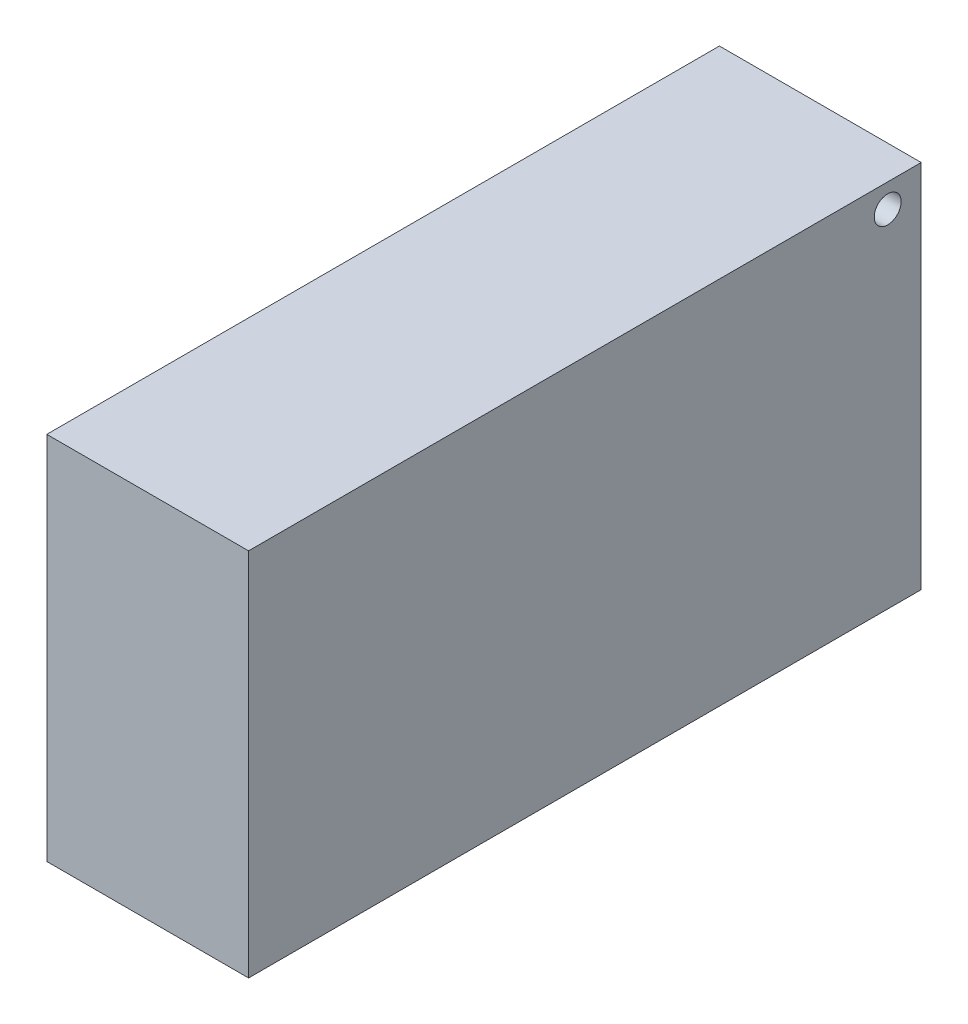
ISO-10303-21;
HEADER;
FILE_DESCRIPTION(('STEP AP214'),'2;1');
FILE_NAME('part.step','',(''),(''),'','','');
FILE_SCHEMA(('AUTOMOTIVE_DESIGN { 1 0 10303 214 1 1 1 1 }'));
ENDSEC;
DATA;
#1=APPLICATION_CONTEXT('core data for automotive mechanical design processes');
#2=APPLICATION_PROTOCOL_DEFINITION('international standard','automotive_design',2000,#1);
#3=PRODUCT_CONTEXT('',#1,'mechanical');
#4=PRODUCT('Part','Part','',(#3));
#5=PRODUCT_RELATED_PRODUCT_CATEGORY('part','',(#4));
#6=PRODUCT_DEFINITION_FORMATION('','',#4);
#7=PRODUCT_DEFINITION_CONTEXT('part definition',#1,'design');
#8=PRODUCT_DEFINITION('design','',#6,#7);
#9=PRODUCT_DEFINITION_SHAPE('','',#8);
#10=(LENGTH_UNIT() NAMED_UNIT(*) SI_UNIT(.MILLI.,.METRE.));
#11=(NAMED_UNIT(*) PLANE_ANGLE_UNIT() SI_UNIT($,.RADIAN.));
#12=(NAMED_UNIT(*) SI_UNIT($,.STERADIAN.) SOLID_ANGLE_UNIT());
#13=UNCERTAINTY_MEASURE_WITH_UNIT(LENGTH_MEASURE(1.E-05),#10,'distance_accuracy_value','');
#14=(GEOMETRIC_REPRESENTATION_CONTEXT(3) GLOBAL_UNCERTAINTY_ASSIGNED_CONTEXT((#13)) GLOBAL_UNIT_ASSIGNED_CONTEXT((#10,
#11,#12)) REPRESENTATION_CONTEXT('',''));
#15=CARTESIAN_POINT('',(0.,0.,0.));
#16=DIRECTION('',(0.,0.,1.));
#17=DIRECTION('',(1.,0.,0.));
#18=AXIS2_PLACEMENT_3D('',#15,#16,#17);
#19=CARTESIAN_POINT('',(60.,108.090723229566,-211.993791229898));
#20=DIRECTION('',(0.,0.,1.));
#21=DIRECTION('',(1.,0.,0.));
#22=AXIS2_PLACEMENT_3D('',#19,#20,#21);
#23=PLANE('',#22);
#24=DIRECTION('',(0.,1.,0.));
#25=VECTOR('',#24,1.);
#26=CARTESIAN_POINT('',(0.,108.090723229566,-211.993791229898));
#27=LINE('',#26,#25);
#28=CARTESIAN_POINT('',(0.,-1.90927677043413,-211.993791229898));
#29=VERTEX_POINT('',#28);
#30=CARTESIAN_POINT('',(0.,108.090723229566,-211.993791229898));
#31=VERTEX_POINT('',#30);
#32=EDGE_CURVE('E98',#29,#31,#27,.T.);
#33=ORIENTED_EDGE('',*,*,#32,.T.);
#34=DIRECTION('',(-1.,0.,0.));
#35=VECTOR('',#34,1.);
#36=CARTESIAN_POINT('',(60.,108.090723229566,-211.993791229898));
#37=LINE('',#36,#35);
#38=CARTESIAN_POINT('',(60.,108.090723229566,-211.993791229898));
#39=VERTEX_POINT('',#38);
#40=EDGE_CURVE('E11',#39,#31,#37,.T.);
#41=ORIENTED_EDGE('',*,*,#40,.F.);
#42=DIRECTION('',(0.,1.,0.));
#43=VECTOR('',#42,1.);
#44=CARTESIAN_POINT('',(60.,108.090723229566,-211.993791229898));
#45=LINE('',#44,#43);
#46=CARTESIAN_POINT('',(60.,-1.90927677043413,-211.993791229898));
#47=VERTEX_POINT('',#46);
#48=EDGE_CURVE('E86',#47,#39,#45,.T.);
#49=ORIENTED_EDGE('',*,*,#48,.F.);
#50=DIRECTION('',(-1.,0.,0.));
#51=VECTOR('',#50,1.);
#52=CARTESIAN_POINT('',(60.,-1.90927677043413,-211.993791229898));
#53=LINE('',#52,#51);
#54=EDGE_CURVE('E94',#47,#29,#53,.T.);
#55=ORIENTED_EDGE('',*,*,#54,.T.);
#56=EDGE_LOOP('',(#33,#41,#49,#55));
#57=FACE_BOUND('',#56,.T.);
#58=ADVANCED_FACE('F35',(#57),#23,.F.);
#59=CARTESIAN_POINT('',(60.,108.090723229566,-211.993791229898));
#60=DIRECTION('',(0.,-1.,0.));
#61=DIRECTION('',(0.,0.,-1.));
#62=AXIS2_PLACEMENT_3D('',#59,#60,#61);
#63=PLANE('',#62);
#64=DIRECTION('',(0.,0.,1.));
#65=VECTOR('',#64,1.);
#66=CARTESIAN_POINT('',(0.,108.090723229566,-211.993791229898));
#67=LINE('',#66,#65);
#68=CARTESIAN_POINT('',(0.,108.090723229566,-11.9937912298979));
#69=VERTEX_POINT('',#68);
#70=EDGE_CURVE('E90',#31,#69,#67,.T.);
#71=ORIENTED_EDGE('',*,*,#70,.T.);
#72=DIRECTION('',(-1.,0.,0.));
#73=VECTOR('',#72,1.);
#74=CARTESIAN_POINT('',(60.,108.090723229566,-11.9937912298979));
#75=LINE('',#74,#73);
#76=CARTESIAN_POINT('',(60.,108.090723229566,-11.9937912298979));
#77=VERTEX_POINT('',#76);
#78=EDGE_CURVE('E43',#77,#69,#75,.T.);
#79=ORIENTED_EDGE('',*,*,#78,.F.);
#80=DIRECTION('',(0.,0.,1.));
#81=VECTOR('',#80,1.);
#82=CARTESIAN_POINT('',(60.,108.090723229566,-211.993791229898));
#83=LINE('',#82,#81);
#84=EDGE_CURVE('E81',#39,#77,#83,.T.);
#85=ORIENTED_EDGE('',*,*,#84,.F.);
#86=ORIENTED_EDGE('',*,*,#40,.T.);
#87=EDGE_LOOP('',(#71,#79,#85,#86));
#88=FACE_BOUND('',#87,.T.);
#89=ADVANCED_FACE('F89',(#88),#63,.F.);
#90=CARTESIAN_POINT('',(60.,108.090723229566,-11.9937912298979));
#91=DIRECTION('',(0.,0.,-1.));
#92=DIRECTION('',(0.,1.,0.));
#93=AXIS2_PLACEMENT_3D('',#90,#91,#92);
#94=PLANE('',#93);
#95=DIRECTION('',(0.,-1.,0.));
#96=VECTOR('',#95,1.);
#97=CARTESIAN_POINT('',(0.,108.090723229566,-11.9937912298979));
#98=LINE('',#97,#96);
#99=CARTESIAN_POINT('',(0.,-1.90927677043416,-11.993791229898));
#100=VERTEX_POINT('',#99);
#101=EDGE_CURVE('E68',#69,#100,#98,.T.);
#102=ORIENTED_EDGE('',*,*,#101,.T.);
#103=DIRECTION('',(-1.,0.,0.));
#104=VECTOR('',#103,1.);
#105=CARTESIAN_POINT('',(60.,-1.90927677043416,-11.993791229898));
#106=LINE('',#105,#104);
#107=CARTESIAN_POINT('',(60.,-1.90927677043416,-11.993791229898));
#108=VERTEX_POINT('',#107);
#109=EDGE_CURVE('E91',#108,#100,#106,.T.);
#110=ORIENTED_EDGE('',*,*,#109,.F.);
#111=DIRECTION('',(0.,-1.,0.));
#112=VECTOR('',#111,1.);
#113=CARTESIAN_POINT('',(60.,108.090723229566,-11.9937912298979));
#114=LINE('',#113,#112);
#115=EDGE_CURVE('E84',#77,#108,#114,.T.);
#116=ORIENTED_EDGE('',*,*,#115,.F.);
#117=ORIENTED_EDGE('',*,*,#78,.T.);
#118=EDGE_LOOP('',(#102,#110,#116,#117));
#119=FACE_BOUND('',#118,.T.);
#120=ADVANCED_FACE('F92',(#119),#94,.F.);
#121=CARTESIAN_POINT('',(60.,-1.90927677043413,-211.993791229898));
#122=DIRECTION('',(0.,1.,0.));
#123=DIRECTION('',(0.,0.,1.));
#124=AXIS2_PLACEMENT_3D('',#121,#122,#123);
#125=PLANE('',#124);
#126=DIRECTION('',(0.,0.,-1.));
#127=VECTOR('',#126,1.);
#128=CARTESIAN_POINT('',(0.,-1.90927677043413,-211.993791229898));
#129=LINE('',#128,#127);
#130=EDGE_CURVE('E74',#100,#29,#129,.T.);
#131=ORIENTED_EDGE('',*,*,#130,.T.);
#132=ORIENTED_EDGE('',*,*,#54,.F.);
#133=DIRECTION('',(0.,0.,-1.));
#134=VECTOR('',#133,1.);
#135=CARTESIAN_POINT('',(60.,-1.90927677043413,-211.993791229898));
#136=LINE('',#135,#134);
#137=EDGE_CURVE('E51',#108,#47,#136,.T.);
#138=ORIENTED_EDGE('',*,*,#137,.F.);
#139=ORIENTED_EDGE('',*,*,#109,.T.);
#140=EDGE_LOOP('',(#131,#132,#138,#139));
#141=FACE_BOUND('',#140,.T.);
#142=ADVANCED_FACE('F106',(#141),#125,.F.);
#143=CARTESIAN_POINT('',(60.,0.,0.));
#144=DIRECTION('',(-1.,0.,0.));
#145=DIRECTION('',(0.,0.,1.));
#146=AXIS2_PLACEMENT_3D('',#143,#144,#145);
#147=PLANE('',#146);
#148=CARTESIAN_POINT('',(60.,101.016084536177,-202.033930040756));
#149=DIRECTION('',(1.,0.,0.));
#150=DIRECTION('',(0.,0.,-1.));
#151=AXIS2_PLACEMENT_3D('',#148,#149,#150);
#152=CIRCLE('',#151,3.99999999999999);
#153=CARTESIAN_POINT('',(60.,101.016084536177,-206.033930040756));
#154=VERTEX_POINT('',#153);
#155=EDGE_CURVE('E112',#154,#154,#152,.T.);
#156=ORIENTED_EDGE('',*,*,#155,.F.);
#157=EDGE_LOOP('',(#156));
#158=FACE_BOUND('',#157,.T.);
#159=ORIENTED_EDGE('',*,*,#48,.T.);
#160=ORIENTED_EDGE('',*,*,#84,.T.);
#161=ORIENTED_EDGE('',*,*,#115,.T.);
#162=ORIENTED_EDGE('',*,*,#137,.T.);
#163=EDGE_LOOP('',(#159,#160,#161,#162));
#164=FACE_BOUND('',#163,.T.);
#165=ADVANCED_FACE('F82',(#158,#164),#147,.F.);
#166=CARTESIAN_POINT('',(0.,0.,0.));
#167=DIRECTION('',(-1.,0.,0.));
#168=DIRECTION('',(0.,0.,1.));
#169=AXIS2_PLACEMENT_3D('',#166,#167,#168);
#170=PLANE('',#169);
#171=ORIENTED_EDGE('',*,*,#32,.F.);
#172=ORIENTED_EDGE('',*,*,#130,.F.);
#173=ORIENTED_EDGE('',*,*,#101,.F.);
#174=ORIENTED_EDGE('',*,*,#70,.F.);
#175=EDGE_LOOP('',(#171,#172,#173,#174));
#176=FACE_BOUND('',#175,.T.);
#177=ADVANCED_FACE('F109',(#176),#170,.T.);
#178=CARTESIAN_POINT('',(40.,101.016084536177,-202.033930040756));
#179=DIRECTION('',(1.,0.,0.));
#180=DIRECTION('',(0.,0.,-1.));
#181=AXIS2_PLACEMENT_3D('',#178,#179,#180);
#182=CYLINDRICAL_SURFACE('',#181,3.99999999999999);
#183=CARTESIAN_POINT('',(40.,101.016084536177,-202.033930040756));
#184=DIRECTION('',(1.,0.,0.));
#185=DIRECTION('',(0.,0.,-1.));
#186=AXIS2_PLACEMENT_3D('',#183,#184,#185);
#187=CIRCLE('',#186,3.99999999999999);
#188=CARTESIAN_POINT('',(40.,101.016084536177,-206.033930040756));
#189=VERTEX_POINT('',#188);
#190=EDGE_CURVE('E101',#189,#189,#187,.T.);
#191=ORIENTED_EDGE('',*,*,#190,.F.);
#192=EDGE_LOOP('',(#191));
#193=FACE_BOUND('',#192,.T.);
#194=ORIENTED_EDGE('',*,*,#155,.T.);
#195=EDGE_LOOP('',(#194));
#196=FACE_BOUND('',#195,.T.);
#197=ADVANCED_FACE('F120',(#193,#196),#182,.F.);
#198=CARTESIAN_POINT('',(40.,101.016084536177,-202.033930040756));
#199=DIRECTION('',(1.,0.,0.));
#200=DIRECTION('',(0.,0.,-1.));
#201=AXIS2_PLACEMENT_3D('',#198,#199,#200);
#202=PLANE('',#201);
#203=ORIENTED_EDGE('',*,*,#190,.T.);
#204=EDGE_LOOP('',(#203));
#205=FACE_BOUND('',#204,.T.);
#206=ADVANCED_FACE('F118',(#205),#202,.T.);
#207=CLOSED_SHELL('',(#58,#89,#120,#142,#165,#177,#197,#206));
#208=MANIFOLD_SOLID_BREP('B2',#207);
#209=ADVANCED_BREP_SHAPE_REPRESENTATION('',(#18,#208),#14);
#210=SHAPE_DEFINITION_REPRESENTATION(#9,#209);
ENDSEC;
END-ISO-10303-21;
